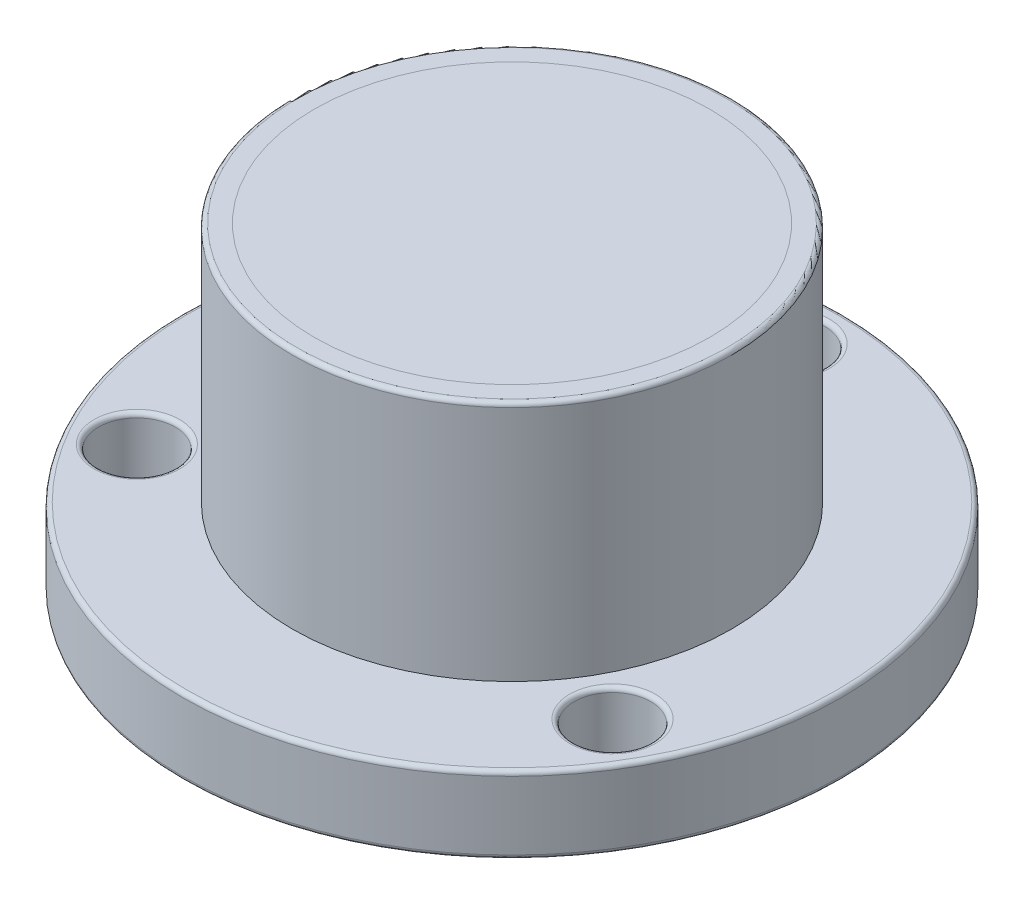
ISO-10303-21;
HEADER;
FILE_DESCRIPTION(('STEP AP214'),'2;1');
FILE_NAME('part.step','',(''),(''),'','','');
FILE_SCHEMA(('AUTOMOTIVE_DESIGN { 1 0 10303 214 1 1 1 1 }'));
ENDSEC;
DATA;
#1=APPLICATION_CONTEXT('core data for automotive mechanical design processes');
#2=APPLICATION_PROTOCOL_DEFINITION('international standard','automotive_design',2000,#1);
#3=PRODUCT_CONTEXT('',#1,'mechanical');
#4=PRODUCT('Part','Part','',(#3));
#5=PRODUCT_RELATED_PRODUCT_CATEGORY('part','',(#4));
#6=PRODUCT_DEFINITION_FORMATION('','',#4);
#7=PRODUCT_DEFINITION_CONTEXT('part definition',#1,'design');
#8=PRODUCT_DEFINITION('design','',#6,#7);
#9=PRODUCT_DEFINITION_SHAPE('','',#8);
#10=(LENGTH_UNIT() NAMED_UNIT(*) SI_UNIT(.MILLI.,.METRE.));
#11=(NAMED_UNIT(*) PLANE_ANGLE_UNIT() SI_UNIT($,.RADIAN.));
#12=(NAMED_UNIT(*) SI_UNIT($,.STERADIAN.) SOLID_ANGLE_UNIT());
#13=UNCERTAINTY_MEASURE_WITH_UNIT(LENGTH_MEASURE(1.E-05),#10,'distance_accuracy_value','');
#14=(GEOMETRIC_REPRESENTATION_CONTEXT(3) GLOBAL_UNCERTAINTY_ASSIGNED_CONTEXT((#13)) GLOBAL_UNIT_ASSIGNED_CONTEXT((#10,
#11,#12)) REPRESENTATION_CONTEXT('',''));
#15=CARTESIAN_POINT('',(0.,0.,0.));
#16=DIRECTION('',(0.,0.,1.));
#17=DIRECTION('',(1.,0.,0.));
#18=AXIS2_PLACEMENT_3D('',#15,#16,#17);
#19=CARTESIAN_POINT('',(0.,3.5,0.));
#20=DIRECTION('',(0.,-1.,0.));
#21=DIRECTION('',(0.,0.,-1.));
#22=AXIS2_PLACEMENT_3D('',#19,#20,#21);
#23=CYLINDRICAL_SURFACE('',#22,15.);
#24=CARTESIAN_POINT('',(0.,0.2,0.));
#25=DIRECTION('',(0.,1.,0.));
#26=DIRECTION('',(0.,0.,1.));
#27=AXIS2_PLACEMENT_3D('',#24,#25,#26);
#28=CIRCLE('',#27,15.);
#29=CARTESIAN_POINT('',(0.,0.2,15.));
#30=VERTEX_POINT('',#29);
#31=EDGE_CURVE('P0_E70',#30,#30,#28,.T.);
#32=ORIENTED_EDGE('',*,*,#31,.T.);
#33=EDGE_LOOP('',(#32));
#34=FACE_BOUND('',#33,.T.);
#35=CARTESIAN_POINT('',(0.,3.3,0.));
#36=DIRECTION('',(0.,1.,0.));
#37=DIRECTION('',(0.,0.,1.));
#38=AXIS2_PLACEMENT_3D('',#35,#36,#37);
#39=CIRCLE('',#38,15.);
#40=CARTESIAN_POINT('',(0.,3.3,15.));
#41=VERTEX_POINT('',#40);
#42=EDGE_CURVE('P0_E73',#41,#41,#39,.F.);
#43=ORIENTED_EDGE('',*,*,#42,.T.);
#44=EDGE_LOOP('',(#43));
#45=FACE_BOUND('',#44,.T.);
#46=ADVANCED_FACE('P0_F14',(#34,#45),#23,.T.);
#47=CARTESIAN_POINT('',(0.,3.5,0.));
#48=DIRECTION('',(0.,1.,0.));
#49=DIRECTION('',(0.,0.,1.));
#50=AXIS2_PLACEMENT_3D('',#47,#48,#49);
#51=PLANE('',#50);
#52=CARTESIAN_POINT('',(0.,3.5,0.));
#53=DIRECTION('',(0.,1.,0.));
#54=DIRECTION('',(0.,0.,1.));
#55=AXIS2_PLACEMENT_3D('',#52,#53,#54);
#56=CIRCLE('',#55,14.8);
#57=CARTESIAN_POINT('',(0.,3.5,14.8));
#58=VERTEX_POINT('',#57);
#59=EDGE_CURVE('P0_E46',#58,#58,#56,.T.);
#60=ORIENTED_EDGE('',*,*,#59,.T.);
#61=EDGE_LOOP('',(#60));
#62=FACE_BOUND('',#61,.T.);
#63=CARTESIAN_POINT('',(-10.8253175473049,3.5,6.25000000000031));
#64=DIRECTION('',(0.,1.,0.));
#65=DIRECTION('',(0.,0.,1.));
#66=AXIS2_PLACEMENT_3D('',#63,#64,#65);
#67=CIRCLE('',#66,1.95000000000071);
#68=CARTESIAN_POINT('',(-10.8253175473049,3.5,8.20000000000102));
#69=VERTEX_POINT('',#68);
#70=EDGE_CURVE('P0_E49',#69,#69,#67,.F.);
#71=ORIENTED_EDGE('',*,*,#70,.T.);
#72=EDGE_LOOP('',(#71));
#73=FACE_BOUND('',#72,.T.);
#74=CARTESIAN_POINT('',(10.825317547306,3.5,6.24999999999969));
#75=DIRECTION('',(0.,1.,0.));
#76=DIRECTION('',(0.,0.,1.));
#77=AXIS2_PLACEMENT_3D('',#74,#75,#76);
#78=CIRCLE('',#77,1.95000000000048);
#79=CARTESIAN_POINT('',(10.825317547306,3.5,8.20000000000017));
#80=VERTEX_POINT('',#79);
#81=EDGE_CURVE('P0_E52',#80,#80,#78,.F.);
#82=ORIENTED_EDGE('',*,*,#81,.T.);
#83=EDGE_LOOP('',(#82));
#84=FACE_BOUND('',#83,.T.);
#85=CARTESIAN_POINT('',(0.,3.5,-12.5));
#86=DIRECTION('',(0.,1.,0.));
#87=DIRECTION('',(0.,0.,1.));
#88=AXIS2_PLACEMENT_3D('',#85,#86,#87);
#89=CIRCLE('',#88,1.95);
#90=CARTESIAN_POINT('',(0.,3.5,-10.55));
#91=VERTEX_POINT('',#90);
#92=EDGE_CURVE('P0_E55',#91,#91,#89,.F.);
#93=ORIENTED_EDGE('',*,*,#92,.T.);
#94=EDGE_LOOP('',(#93));
#95=FACE_BOUND('',#94,.T.);
#96=CARTESIAN_POINT('',(0.,3.5,0.));
#97=DIRECTION('',(0.,1.,0.));
#98=DIRECTION('',(0.,0.,1.));
#99=AXIS2_PLACEMENT_3D('',#96,#97,#98);
#100=CIRCLE('',#99,10.);
#101=CARTESIAN_POINT('',(0.,3.5,-10.));
#102=VERTEX_POINT('',#101);
#103=EDGE_CURVE('P0_E76',#102,#102,#100,.T.);
#104=ORIENTED_EDGE('',*,*,#103,.F.);
#105=EDGE_LOOP('',(#104));
#106=FACE_BOUND('',#105,.T.);
#107=ADVANCED_FACE('P0_F116',(#62,#73,#84,#95,#106),#51,.T.);
#108=CARTESIAN_POINT('',(0.,0.,0.));
#109=DIRECTION('',(0.,1.,0.));
#110=DIRECTION('',(0.,0.,1.));
#111=AXIS2_PLACEMENT_3D('',#108,#109,#110);
#112=PLANE('',#111);
#113=CARTESIAN_POINT('',(0.,0.,0.));
#114=DIRECTION('',(0.,1.,0.));
#115=DIRECTION('',(0.,0.,1.));
#116=AXIS2_PLACEMENT_3D('',#113,#114,#115);
#117=CIRCLE('',#116,14.8);
#118=CARTESIAN_POINT('',(0.,0.,14.8));
#119=VERTEX_POINT('',#118);
#120=EDGE_CURVE('P0_E58',#119,#119,#117,.F.);
#121=ORIENTED_EDGE('',*,*,#120,.T.);
#122=EDGE_LOOP('',(#121));
#123=FACE_BOUND('',#122,.T.);
#124=CARTESIAN_POINT('',(-10.8253175473049,0.,6.25000000000031));
#125=DIRECTION('',(0.,1.,0.));
#126=DIRECTION('',(0.,0.,1.));
#127=AXIS2_PLACEMENT_3D('',#124,#125,#126);
#128=CIRCLE('',#127,1.95000000000071);
#129=CARTESIAN_POINT('',(-10.8253175473049,0.,8.20000000000102));
#130=VERTEX_POINT('',#129);
#131=EDGE_CURVE('P0_E61',#130,#130,#128,.T.);
#132=ORIENTED_EDGE('',*,*,#131,.T.);
#133=EDGE_LOOP('',(#132));
#134=FACE_BOUND('',#133,.T.);
#135=CARTESIAN_POINT('',(10.825317547306,0.,6.24999999999969));
#136=DIRECTION('',(0.,1.,0.));
#137=DIRECTION('',(0.,0.,1.));
#138=AXIS2_PLACEMENT_3D('',#135,#136,#137);
#139=CIRCLE('',#138,1.95000000000048);
#140=CARTESIAN_POINT('',(10.825317547306,0.,8.20000000000017));
#141=VERTEX_POINT('',#140);
#142=EDGE_CURVE('P0_E64',#141,#141,#139,.T.);
#143=ORIENTED_EDGE('',*,*,#142,.T.);
#144=EDGE_LOOP('',(#143));
#145=FACE_BOUND('',#144,.T.);
#146=CARTESIAN_POINT('',(0.,0.,-12.5));
#147=DIRECTION('',(0.,1.,0.));
#148=DIRECTION('',(0.,0.,1.));
#149=AXIS2_PLACEMENT_3D('',#146,#147,#148);
#150=CIRCLE('',#149,1.95);
#151=CARTESIAN_POINT('',(0.,0.,-10.55));
#152=VERTEX_POINT('',#151);
#153=EDGE_CURVE('P0_E67',#152,#152,#150,.T.);
#154=ORIENTED_EDGE('',*,*,#153,.T.);
#155=EDGE_LOOP('',(#154));
#156=FACE_BOUND('',#155,.T.);
#157=ADVANCED_FACE('P0_F122',(#123,#134,#145,#156),#112,.F.);
#158=CARTESIAN_POINT('',(0.,0.,-12.5));
#159=DIRECTION('',(0.,1.,0.));
#160=DIRECTION('',(0.,0.,1.));
#161=AXIS2_PLACEMENT_3D('',#158,#159,#160);
#162=CYLINDRICAL_SURFACE('',#161,1.75);
#163=CARTESIAN_POINT('',(0.,3.3,-12.5));
#164=DIRECTION('',(0.,1.,0.));
#165=DIRECTION('',(0.,0.,1.));
#166=AXIS2_PLACEMENT_3D('',#163,#164,#165);
#167=CIRCLE('',#166,1.75);
#168=CARTESIAN_POINT('',(0.,3.3,-10.75));
#169=VERTEX_POINT('',#168);
#170=EDGE_CURVE('P0_E25',#169,#169,#167,.T.);
#171=ORIENTED_EDGE('',*,*,#170,.T.);
#172=EDGE_LOOP('',(#171));
#173=FACE_BOUND('',#172,.T.);
#174=CARTESIAN_POINT('',(0.,0.2,-12.5));
#175=DIRECTION('',(0.,1.,0.));
#176=DIRECTION('',(0.,0.,1.));
#177=AXIS2_PLACEMENT_3D('',#174,#175,#176);
#178=CIRCLE('',#177,1.75);
#179=CARTESIAN_POINT('',(0.,0.2,-10.75));
#180=VERTEX_POINT('',#179);
#181=EDGE_CURVE('P0_E29',#180,#180,#178,.F.);
#182=ORIENTED_EDGE('',*,*,#181,.T.);
#183=EDGE_LOOP('',(#182));
#184=FACE_BOUND('',#183,.T.);
#185=ADVANCED_FACE('P0_F168',(#173,#184),#162,.F.);
#186=CARTESIAN_POINT('',(10.825317547306,0.,6.24999999999969));
#187=DIRECTION('',(0.,1.,0.));
#188=DIRECTION('',(0.,0.,1.));
#189=AXIS2_PLACEMENT_3D('',#186,#187,#188);
#190=CYLINDRICAL_SURFACE('',#189,1.75000000000048);
#191=CARTESIAN_POINT('',(10.825317547306,3.3,6.24999999999969));
#192=DIRECTION('',(0.,1.,0.));
#193=DIRECTION('',(0.,0.,1.));
#194=AXIS2_PLACEMENT_3D('',#191,#192,#193);
#195=CIRCLE('',#194,1.75000000000048);
#196=CARTESIAN_POINT('',(10.825317547306,3.3,8.00000000000017));
#197=VERTEX_POINT('',#196);
#198=EDGE_CURVE('P0_E34',#197,#197,#195,.T.);
#199=ORIENTED_EDGE('',*,*,#198,.T.);
#200=EDGE_LOOP('',(#199));
#201=FACE_BOUND('',#200,.T.);
#202=CARTESIAN_POINT('',(10.825317547306,0.2,6.24999999999969));
#203=DIRECTION('',(0.,1.,0.));
#204=DIRECTION('',(0.,0.,1.));
#205=AXIS2_PLACEMENT_3D('',#202,#203,#204);
#206=CIRCLE('',#205,1.75000000000048);
#207=CARTESIAN_POINT('',(10.825317547306,0.2,8.00000000000017));
#208=VERTEX_POINT('',#207);
#209=EDGE_CURVE('P0_E37',#208,#208,#206,.F.);
#210=ORIENTED_EDGE('',*,*,#209,.T.);
#211=EDGE_LOOP('',(#210));
#212=FACE_BOUND('',#211,.T.);
#213=ADVANCED_FACE('P0_F173',(#201,#212),#190,.F.);
#214=CARTESIAN_POINT('',(-10.8253175473049,0.,6.25000000000031));
#215=DIRECTION('',(0.,1.,0.));
#216=DIRECTION('',(0.,0.,1.));
#217=AXIS2_PLACEMENT_3D('',#214,#215,#216);
#218=CYLINDRICAL_SURFACE('',#217,1.75000000000071);
#219=CARTESIAN_POINT('',(-10.8253175473049,3.3,6.25000000000031));
#220=DIRECTION('',(0.,1.,0.));
#221=DIRECTION('',(0.,0.,1.));
#222=AXIS2_PLACEMENT_3D('',#219,#220,#221);
#223=CIRCLE('',#222,1.75000000000071);
#224=CARTESIAN_POINT('',(-10.8253175473049,3.3,8.00000000000102));
#225=VERTEX_POINT('',#224);
#226=EDGE_CURVE('P0_E40',#225,#225,#223,.T.);
#227=ORIENTED_EDGE('',*,*,#226,.T.);
#228=EDGE_LOOP('',(#227));
#229=FACE_BOUND('',#228,.T.);
#230=CARTESIAN_POINT('',(-10.8253175473049,0.2,6.25000000000031));
#231=DIRECTION('',(0.,1.,0.));
#232=DIRECTION('',(0.,0.,1.));
#233=AXIS2_PLACEMENT_3D('',#230,#231,#232);
#234=CIRCLE('',#233,1.75000000000071);
#235=CARTESIAN_POINT('',(-10.8253175473049,0.2,8.00000000000102));
#236=VERTEX_POINT('',#235);
#237=EDGE_CURVE('P0_E43',#236,#236,#234,.F.);
#238=ORIENTED_EDGE('',*,*,#237,.T.);
#239=EDGE_LOOP('',(#238));
#240=FACE_BOUND('',#239,.T.);
#241=ADVANCED_FACE('P0_F112',(#229,#240),#218,.F.);
#242=CARTESIAN_POINT('',(0.,14.5,0.));
#243=DIRECTION('',(0.,-1.,0.));
#244=DIRECTION('',(0.,0.,-1.));
#245=AXIS2_PLACEMENT_3D('',#242,#243,#244);
#246=CYLINDRICAL_SURFACE('',#245,10.);
#247=CARTESIAN_POINT('',(0.,14.3,0.));
#248=DIRECTION('',(0.,-1.,0.));
#249=DIRECTION('',(0.,0.,-1.));
#250=AXIS2_PLACEMENT_3D('',#247,#248,#249);
#251=CIRCLE('',#250,10.);
#252=CARTESIAN_POINT('',(0.,14.3,-10.));
#253=VERTEX_POINT('',#252);
#254=EDGE_CURVE('P0_E21',#253,#253,#251,.T.);
#255=CARTESIAN_POINT('',(0.,14.3,-10.));
#256=CARTESIAN_POINT('',(0.,14.1875,-10.));
#257=CARTESIAN_POINT('',(0.,14.075,-10.));
#258=CARTESIAN_POINT('',(0.,13.85,-10.));
#259=CARTESIAN_POINT('',(0.,13.7375,-10.));
#260=CARTESIAN_POINT('',(0.,13.5125,-10.));
#261=CARTESIAN_POINT('',(0.,13.4,-10.));
#262=CARTESIAN_POINT('',(0.,13.175,-10.));
#263=CARTESIAN_POINT('',(0.,13.0625,-10.));
#264=CARTESIAN_POINT('',(0.,12.8375,-10.));
#265=CARTESIAN_POINT('',(0.,12.725,-10.));
#266=CARTESIAN_POINT('',(0.,12.5,-10.));
#267=CARTESIAN_POINT('',(0.,12.3875,-10.));
#268=CARTESIAN_POINT('',(0.,12.1625,-10.));
#269=CARTESIAN_POINT('',(0.,12.05,-10.));
#270=CARTESIAN_POINT('',(0.,11.825,-10.));
#271=CARTESIAN_POINT('',(0.,11.7125,-10.));
#272=CARTESIAN_POINT('',(0.,11.4875,-10.));
#273=CARTESIAN_POINT('',(0.,11.375,-10.));
#274=CARTESIAN_POINT('',(0.,11.15,-10.));
#275=CARTESIAN_POINT('',(0.,11.0375,-10.));
#276=CARTESIAN_POINT('',(0.,10.8125,-10.));
#277=CARTESIAN_POINT('',(0.,10.7,-10.));
#278=CARTESIAN_POINT('',(0.,10.475,-10.));
#279=CARTESIAN_POINT('',(0.,10.3625,-10.));
#280=CARTESIAN_POINT('',(0.,10.1375,-10.));
#281=CARTESIAN_POINT('',(0.,10.025,-10.));
#282=CARTESIAN_POINT('',(0.,9.8,-10.));
#283=CARTESIAN_POINT('',(0.,9.6875,-10.));
#284=CARTESIAN_POINT('',(0.,9.4625,-10.));
#285=CARTESIAN_POINT('',(0.,9.35,-10.));
#286=CARTESIAN_POINT('',(0.,9.125,-10.));
#287=CARTESIAN_POINT('',(0.,9.0125,-10.));
#288=CARTESIAN_POINT('',(0.,8.7875,-10.));
#289=CARTESIAN_POINT('',(0.,8.675,-10.));
#290=CARTESIAN_POINT('',(0.,8.45,-10.));
#291=CARTESIAN_POINT('',(0.,8.3375,-10.));
#292=CARTESIAN_POINT('',(0.,8.1125,-10.));
#293=CARTESIAN_POINT('',(0.,8.,-10.));
#294=CARTESIAN_POINT('',(0.,7.775,-10.));
#295=CARTESIAN_POINT('',(0.,7.6625,-10.));
#296=CARTESIAN_POINT('',(0.,7.4375,-10.));
#297=CARTESIAN_POINT('',(0.,7.325,-10.));
#298=CARTESIAN_POINT('',(0.,7.1,-10.));
#299=CARTESIAN_POINT('',(0.,6.9875,-10.));
#300=CARTESIAN_POINT('',(0.,6.7625,-10.));
#301=CARTESIAN_POINT('',(0.,6.65,-10.));
#302=CARTESIAN_POINT('',(0.,6.425,-10.));
#303=CARTESIAN_POINT('',(0.,6.3125,-10.));
#304=CARTESIAN_POINT('',(0.,6.0875,-10.));
#305=CARTESIAN_POINT('',(0.,5.975,-10.));
#306=CARTESIAN_POINT('',(0.,5.75,-10.));
#307=CARTESIAN_POINT('',(0.,5.6375,-10.));
#308=CARTESIAN_POINT('',(0.,5.4125,-10.));
#309=CARTESIAN_POINT('',(0.,5.3,-10.));
#310=CARTESIAN_POINT('',(0.,5.075,-10.));
#311=CARTESIAN_POINT('',(0.,4.9625,-10.));
#312=CARTESIAN_POINT('',(0.,4.7375,-10.));
#313=CARTESIAN_POINT('',(0.,4.625,-10.));
#314=CARTESIAN_POINT('',(0.,4.4,-10.));
#315=CARTESIAN_POINT('',(0.,4.2875,-10.));
#316=CARTESIAN_POINT('',(0.,4.0625,-10.));
#317=CARTESIAN_POINT('',(0.,3.95,-10.));
#318=CARTESIAN_POINT('',(0.,3.725,-10.));
#319=CARTESIAN_POINT('',(0.,3.6125,-10.));
#320=CARTESIAN_POINT('',(0.,3.5,-10.));
#321=B_SPLINE_CURVE_WITH_KNOTS('',3,(#255,#256,#257,#258,#259,#260,#261,#262,#263,#264,#265,
#266,#267,#268,#269,#270,#271,#272,#273,#274,#275,#276,#277,#278,#279,#280,#281,#282,#283,#284,
#285,#286,#287,#288,#289,#290,#291,#292,#293,#294,#295,#296,#297,#298,#299,#300,#301,#302,#303,
#304,#305,#306,#307,#308,#309,#310,#311,#312,#313,#314,#315,#316,#317,#318,#319,#320),
.UNSPECIFIED.,.F.,.F.,(4,2,2,2,2,2,2,2,2,2,2,2,2,2,2,2,2,2,2,2,2,2,2,2,2,2,2,2,2,2,2,2,4),(0.,
0.337500000000001,0.675,1.0125,1.35,1.6875,2.025,2.3625,2.7,3.0375,3.375,3.7125,4.05,4.3875,
4.725,5.0625,5.4,5.7375,6.075,6.4125,6.75,7.0875,7.425,7.7625,8.1,8.4375,8.775,9.1125,9.45,
9.7875,10.125,10.4625,10.8),.UNSPECIFIED.);
#322=EDGE_CURVE('P0_BSEAM104',#253,#102,#321,.T.);
#323=ORIENTED_EDGE('',*,*,#254,.T.);
#324=ORIENTED_EDGE('',*,*,#103,.T.);
#325=ORIENTED_EDGE('',*,*,#322,.T.);
#326=ORIENTED_EDGE('',*,*,#322,.F.);
#327=EDGE_LOOP('',(#323,#325,#324,#326));
#328=FACE_BOUND('',#327,.T.);
#329=ADVANCED_FACE('P0_F104',(#328),#246,.T.);
#330=CARTESIAN_POINT('',(0.,14.5,0.));
#331=DIRECTION('',(0.,-1.,0.));
#332=DIRECTION('',(0.,0.,-1.));
#333=AXIS2_PLACEMENT_3D('',#330,#331,#332);
#334=PLANE('',#333);
#335=CARTESIAN_POINT('',(0.,14.5,0.));
#336=DIRECTION('',(0.,-1.,0.));
#337=DIRECTION('',(0.,0.,-1.));
#338=AXIS2_PLACEMENT_3D('',#335,#336,#337);
#339=CIRCLE('',#338,9.8);
#340=CARTESIAN_POINT('',(0.,14.5,-9.8));
#341=VERTEX_POINT('',#340);
#342=EDGE_CURVE('P0_E10',#341,#341,#339,.F.);
#343=ORIENTED_EDGE('',*,*,#342,.T.);
#344=EDGE_LOOP('',(#343));
#345=FACE_BOUND('',#344,.T.);
#346=CARTESIAN_POINT('',(0.,14.5,0.));
#347=DIRECTION('',(0.,1.,0.));
#348=DIRECTION('',(0.,0.,1.));
#349=AXIS2_PLACEMENT_3D('',#346,#347,#348);
#350=CIRCLE('',#349,9.);
#351=CARTESIAN_POINT('',(0.,14.5,9.));
#352=VERTEX_POINT('',#351);
#353=EDGE_CURVE('P0_E86',#352,#352,#350,.T.);
#354=ORIENTED_EDGE('',*,*,#353,.F.);
#355=EDGE_LOOP('',(#354));
#356=FACE_BOUND('',#355,.T.);
#357=ADVANCED_FACE('P0_F102',(#345,#356),#334,.F.);
#358=CARTESIAN_POINT('',(0.,13.5,0.));
#359=DIRECTION('',(0.,1.,0.));
#360=DIRECTION('',(0.,0.,1.));
#361=AXIS2_PLACEMENT_3D('',#358,#359,#360);
#362=PLANE('',#361);
#363=CARTESIAN_POINT('',(0.,13.5,0.));
#364=DIRECTION('',(0.,1.,0.));
#365=DIRECTION('',(0.,0.,1.));
#366=AXIS2_PLACEMENT_3D('',#363,#364,#365);
#367=CIRCLE('',#366,9.);
#368=CARTESIAN_POINT('',(0.,13.5,9.));
#369=VERTEX_POINT('',#368);
#370=EDGE_CURVE('P0_E81',#369,#369,#367,.T.);
#371=ORIENTED_EDGE('',*,*,#370,.T.);
#372=EDGE_LOOP('',(#371));
#373=FACE_BOUND('',#372,.T.);
#374=CARTESIAN_POINT('',(0.,13.5,0.));
#375=DIRECTION('',(0.,1.,0.));
#376=DIRECTION('',(0.,0.,1.));
#377=AXIS2_PLACEMENT_3D('',#374,#375,#376);
#378=CIRCLE('',#377,8.);
#379=CARTESIAN_POINT('',(0.,13.5,8.));
#380=VERTEX_POINT('',#379);
#381=EDGE_CURVE('P0_E77',#380,#380,#378,.F.);
#382=ORIENTED_EDGE('',*,*,#381,.T.);
#383=EDGE_LOOP('',(#382));
#384=FACE_BOUND('',#383,.T.);
#385=ADVANCED_FACE('P0_F92',(#373,#384),#362,.T.);
#386=CARTESIAN_POINT('',(0.,13.5,0.));
#387=DIRECTION('',(0.,1.,0.));
#388=DIRECTION('',(0.,0.,1.));
#389=AXIS2_PLACEMENT_3D('',#386,#387,#388);
#390=CYLINDRICAL_SURFACE('',#389,9.);
#391=ORIENTED_EDGE('',*,*,#370,.F.);
#392=EDGE_LOOP('',(#391));
#393=FACE_BOUND('',#392,.T.);
#394=ORIENTED_EDGE('',*,*,#353,.T.);
#395=EDGE_LOOP('',(#394));
#396=FACE_BOUND('',#395,.T.);
#397=ADVANCED_FACE('P0_F95',(#393,#396),#390,.F.);
#398=CARTESIAN_POINT('',(0.,6.5,0.));
#399=DIRECTION('',(0.,1.,0.));
#400=DIRECTION('',(0.,0.,1.));
#401=AXIS2_PLACEMENT_3D('',#398,#399,#400);
#402=PLANE('',#401);
#403=CARTESIAN_POINT('',(0.,6.5,0.));
#404=DIRECTION('',(0.,1.,0.));
#405=DIRECTION('',(0.,0.,1.));
#406=AXIS2_PLACEMENT_3D('',#403,#404,#405);
#407=CIRCLE('',#406,8.);
#408=CARTESIAN_POINT('',(0.,6.5,8.));
#409=VERTEX_POINT('',#408);
#410=EDGE_CURVE('P0_E80',#409,#409,#407,.T.);
#411=ORIENTED_EDGE('',*,*,#410,.T.);
#412=EDGE_LOOP('',(#411));
#413=FACE_BOUND('',#412,.T.);
#414=ADVANCED_FACE('P0_F98',(#413),#402,.T.);
#415=CARTESIAN_POINT('',(0.,6.5,0.));
#416=DIRECTION('',(0.,1.,0.));
#417=DIRECTION('',(0.,0.,1.));
#418=AXIS2_PLACEMENT_3D('',#415,#416,#417);
#419=CYLINDRICAL_SURFACE('',#418,8.);
#420=ORIENTED_EDGE('',*,*,#410,.F.);
#421=EDGE_LOOP('',(#420));
#422=FACE_BOUND('',#421,.T.);
#423=ORIENTED_EDGE('',*,*,#381,.F.);
#424=EDGE_LOOP('',(#423));
#425=FACE_BOUND('',#424,.T.);
#426=ADVANCED_FACE('P0_F132',(#422,#425),#419,.F.);
#427=CARTESIAN_POINT('',(0.,0.2,0.));
#428=DIRECTION('',(0.,1.,0.));
#429=DIRECTION('',(0.,0.,1.));
#430=AXIS2_PLACEMENT_3D('',#427,#428,#429);
#431=TOROIDAL_SURFACE('',#430,14.8,0.2);
#432=ORIENTED_EDGE('',*,*,#120,.F.);
#433=EDGE_LOOP('',(#432));
#434=FACE_BOUND('',#433,.T.);
#435=ORIENTED_EDGE('',*,*,#31,.F.);
#436=EDGE_LOOP('',(#435));
#437=FACE_BOUND('',#436,.T.);
#438=ADVANCED_FACE('P0_F128',(#434,#437),#431,.T.);
#439=CARTESIAN_POINT('',(0.,3.3,0.));
#440=DIRECTION('',(0.,1.,0.));
#441=DIRECTION('',(0.,0.,1.));
#442=AXIS2_PLACEMENT_3D('',#439,#440,#441);
#443=TOROIDAL_SURFACE('',#442,14.8,0.2);
#444=ORIENTED_EDGE('',*,*,#42,.F.);
#445=EDGE_LOOP('',(#444));
#446=FACE_BOUND('',#445,.T.);
#447=ORIENTED_EDGE('',*,*,#59,.F.);
#448=EDGE_LOOP('',(#447));
#449=FACE_BOUND('',#448,.T.);
#450=ADVANCED_FACE('P0_F131',(#446,#449),#443,.T.);
#451=CARTESIAN_POINT('',(-10.8253175473049,3.3,6.25000000000031));
#452=DIRECTION('',(0.,1.,0.));
#453=DIRECTION('',(0.,0.,1.));
#454=AXIS2_PLACEMENT_3D('',#451,#452,#453);
#455=TOROIDAL_SURFACE('',#454,1.95000000000071,0.2);
#456=ORIENTED_EDGE('',*,*,#70,.F.);
#457=EDGE_LOOP('',(#456));
#458=FACE_BOUND('',#457,.T.);
#459=ORIENTED_EDGE('',*,*,#226,.F.);
#460=EDGE_LOOP('',(#459));
#461=FACE_BOUND('',#460,.T.);
#462=ADVANCED_FACE('P0_F136',(#458,#461),#455,.T.);
#463=CARTESIAN_POINT('',(-10.8253175473049,0.2,6.25000000000031));
#464=DIRECTION('',(0.,1.,0.));
#465=DIRECTION('',(0.,0.,1.));
#466=AXIS2_PLACEMENT_3D('',#463,#464,#465);
#467=TOROIDAL_SURFACE('',#466,1.95000000000071,0.2);
#468=ORIENTED_EDGE('',*,*,#237,.F.);
#469=EDGE_LOOP('',(#468));
#470=FACE_BOUND('',#469,.T.);
#471=ORIENTED_EDGE('',*,*,#131,.F.);
#472=EDGE_LOOP('',(#471));
#473=FACE_BOUND('',#472,.T.);
#474=ADVANCED_FACE('P0_F140',(#470,#473),#467,.T.);
#475=CARTESIAN_POINT('',(10.825317547306,3.3,6.24999999999969));
#476=DIRECTION('',(0.,1.,0.));
#477=DIRECTION('',(0.,0.,1.));
#478=AXIS2_PLACEMENT_3D('',#475,#476,#477);
#479=TOROIDAL_SURFACE('',#478,1.95000000000048,0.2);
#480=ORIENTED_EDGE('',*,*,#81,.F.);
#481=EDGE_LOOP('',(#480));
#482=FACE_BOUND('',#481,.T.);
#483=ORIENTED_EDGE('',*,*,#198,.F.);
#484=EDGE_LOOP('',(#483));
#485=FACE_BOUND('',#484,.T.);
#486=ADVANCED_FACE('P0_F144',(#482,#485),#479,.T.);
#487=CARTESIAN_POINT('',(10.825317547306,0.2,6.24999999999969));
#488=DIRECTION('',(0.,1.,0.));
#489=DIRECTION('',(0.,0.,1.));
#490=AXIS2_PLACEMENT_3D('',#487,#488,#489);
#491=TOROIDAL_SURFACE('',#490,1.95000000000048,0.2);
#492=ORIENTED_EDGE('',*,*,#209,.F.);
#493=EDGE_LOOP('',(#492));
#494=FACE_BOUND('',#493,.T.);
#495=ORIENTED_EDGE('',*,*,#142,.F.);
#496=EDGE_LOOP('',(#495));
#497=FACE_BOUND('',#496,.T.);
#498=ADVANCED_FACE('P0_F148',(#494,#497),#491,.T.);
#499=CARTESIAN_POINT('',(0.,3.3,-12.5));
#500=DIRECTION('',(0.,1.,0.));
#501=DIRECTION('',(0.,0.,1.));
#502=AXIS2_PLACEMENT_3D('',#499,#500,#501);
#503=TOROIDAL_SURFACE('',#502,1.95,0.2);
#504=ORIENTED_EDGE('',*,*,#92,.F.);
#505=EDGE_LOOP('',(#504));
#506=FACE_BOUND('',#505,.T.);
#507=ORIENTED_EDGE('',*,*,#170,.F.);
#508=EDGE_LOOP('',(#507));
#509=FACE_BOUND('',#508,.T.);
#510=ADVANCED_FACE('P0_F152',(#506,#509),#503,.T.);
#511=CARTESIAN_POINT('',(0.,0.2,-12.5));
#512=DIRECTION('',(0.,1.,0.));
#513=DIRECTION('',(0.,0.,1.));
#514=AXIS2_PLACEMENT_3D('',#511,#512,#513);
#515=TOROIDAL_SURFACE('',#514,1.95,0.2);
#516=ORIENTED_EDGE('',*,*,#181,.F.);
#517=EDGE_LOOP('',(#516));
#518=FACE_BOUND('',#517,.T.);
#519=ORIENTED_EDGE('',*,*,#153,.F.);
#520=EDGE_LOOP('',(#519));
#521=FACE_BOUND('',#520,.T.);
#522=ADVANCED_FACE('P0_F155',(#518,#521),#515,.T.);
#523=CARTESIAN_POINT('',(0.,14.3,0.));
#524=DIRECTION('',(0.,-1.,0.));
#525=DIRECTION('',(0.,0.,-1.));
#526=AXIS2_PLACEMENT_3D('',#523,#524,#525);
#527=TOROIDAL_SURFACE('',#526,9.8,0.2);
#528=ORIENTED_EDGE('',*,*,#342,.F.);
#529=EDGE_LOOP('',(#528));
#530=FACE_BOUND('',#529,.T.);
#531=ORIENTED_EDGE('',*,*,#254,.F.);
#532=EDGE_LOOP('',(#531));
#533=FACE_BOUND('',#532,.T.);
#534=ADVANCED_FACE('P0_F16',(#530,#533),#527,.T.);
#535=CLOSED_SHELL('',(#46,#107,#157,#185,#213,#241,#329,#357,#385,#397,#414,#426,#438,#450,#462,
#474,#486,#498,#510,#522,#534));
#536=MANIFOLD_SOLID_BREP('P0_B1',#535);
#537=CARTESIAN_POINT('',(0.,14.4,0.));
#538=DIRECTION('',(0.,-1.,0.));
#539=DIRECTION('',(-1.,0.,0.));
#540=AXIS2_PLACEMENT_3D('',#537,#538,#539);
#541=PLANE('',#540);
#542=CARTESIAN_POINT('',(0.,14.4,0.));
#543=DIRECTION('',(0.,-1.,0.));
#544=DIRECTION('',(-1.,0.,0.));
#545=AXIS2_PLACEMENT_3D('',#542,#543,#544);
#546=CIRCLE('',#545,4.3);
#547=CARTESIAN_POINT('',(-4.3,14.4,0.));
#548=VERTEX_POINT('',#547);
#549=EDGE_CURVE('P1_E10',#548,#548,#546,.T.);
#550=ORIENTED_EDGE('',*,*,#549,.T.);
#551=EDGE_LOOP('',(#550));
#552=FACE_BOUND('',#551,.T.);
#553=CARTESIAN_POINT('',(0.,14.4,0.));
#554=DIRECTION('',(0.,-1.,0.));
#555=DIRECTION('',(-1.,0.,0.));
#556=AXIS2_PLACEMENT_3D('',#553,#554,#555);
#557=CIRCLE('',#556,4.);
#558=CARTESIAN_POINT('',(-4.,14.4,0.));
#559=VERTEX_POINT('',#558);
#560=EDGE_CURVE('P1_E25',#559,#559,#557,.T.);
#561=ORIENTED_EDGE('',*,*,#560,.F.);
#562=EDGE_LOOP('',(#561));
#563=FACE_BOUND('',#562,.T.);
#564=ADVANCED_FACE('P1_F14',(#552,#563),#541,.T.);
#565=CARTESIAN_POINT('',(0.,14.5,0.));
#566=DIRECTION('',(0.,-1.,0.));
#567=DIRECTION('',(-1.,0.,0.));
#568=AXIS2_PLACEMENT_3D('',#565,#566,#567);
#569=PLANE('',#568);
#570=CARTESIAN_POINT('',(0.,14.5,0.));
#571=DIRECTION('',(0.,-1.,0.));
#572=DIRECTION('',(-1.,0.,0.));
#573=AXIS2_PLACEMENT_3D('',#570,#571,#572);
#574=CIRCLE('',#573,4.3);
#575=CARTESIAN_POINT('',(-4.3,14.5,0.));
#576=VERTEX_POINT('',#575);
#577=EDGE_CURVE('P1_E18',#576,#576,#574,.T.);
#578=ORIENTED_EDGE('',*,*,#577,.F.);
#579=EDGE_LOOP('',(#578));
#580=FACE_BOUND('',#579,.T.);
#581=CARTESIAN_POINT('',(0.,14.5,0.));
#582=DIRECTION('',(0.,-1.,0.));
#583=DIRECTION('',(-1.,0.,0.));
#584=AXIS2_PLACEMENT_3D('',#581,#582,#583);
#585=CIRCLE('',#584,4.);
#586=CARTESIAN_POINT('',(-4.,14.5,0.));
#587=VERTEX_POINT('',#586);
#588=EDGE_CURVE('P1_E27',#587,#587,#585,.T.);
#589=ORIENTED_EDGE('',*,*,#588,.T.);
#590=EDGE_LOOP('',(#589));
#591=FACE_BOUND('',#590,.T.);
#592=ADVANCED_FACE('P1_F37',(#580,#591),#569,.F.);
#593=CARTESIAN_POINT('',(0.,14.4,0.));
#594=DIRECTION('',(0.,1.,0.));
#595=DIRECTION('',(1.,0.,0.));
#596=AXIS2_PLACEMENT_3D('',#593,#594,#595);
#597=CYLINDRICAL_SURFACE('',#596,4.3);
#598=ORIENTED_EDGE('',*,*,#549,.F.);
#599=EDGE_LOOP('',(#598));
#600=FACE_BOUND('',#599,.T.);
#601=ORIENTED_EDGE('',*,*,#577,.T.);
#602=EDGE_LOOP('',(#601));
#603=FACE_BOUND('',#602,.T.);
#604=ADVANCED_FACE('P1_F16',(#600,#603),#597,.T.);
#605=CARTESIAN_POINT('',(0.,14.4,0.));
#606=DIRECTION('',(0.,1.,0.));
#607=DIRECTION('',(1.,0.,0.));
#608=AXIS2_PLACEMENT_3D('',#605,#606,#607);
#609=CYLINDRICAL_SURFACE('',#608,4.);
#610=ORIENTED_EDGE('',*,*,#560,.T.);
#611=EDGE_LOOP('',(#610));
#612=FACE_BOUND('',#611,.T.);
#613=ORIENTED_EDGE('',*,*,#588,.F.);
#614=EDGE_LOOP('',(#613));
#615=FACE_BOUND('',#614,.T.);
#616=ADVANCED_FACE('P1_F33',(#612,#615),#609,.F.);
#617=CLOSED_SHELL('',(#564,#592,#604,#616));
#618=MANIFOLD_SOLID_BREP('P1_B1',#617);
#619=CARTESIAN_POINT('',(0.,14.5,0.));
#620=DIRECTION('',(0.,-1.,0.));
#621=DIRECTION('',(-1.,0.,0.));
#622=AXIS2_PLACEMENT_3D('',#619,#620,#621);
#623=CYLINDRICAL_SURFACE('',#622,9.);
#624=CARTESIAN_POINT('',(0.,14.5,0.));
#625=DIRECTION('',(0.,1.,0.));
#626=DIRECTION('',(1.,0.,0.));
#627=AXIS2_PLACEMENT_3D('',#624,#625,#626);
#628=CIRCLE('',#627,9.);
#629=CARTESIAN_POINT('',(9.,14.5,0.));
#630=VERTEX_POINT('',#629);
#631=EDGE_CURVE('P2_E10',#630,#630,#628,.T.);
#632=ORIENTED_EDGE('',*,*,#631,.F.);
#633=EDGE_LOOP('',(#632));
#634=FACE_BOUND('',#633,.T.);
#635=CARTESIAN_POINT('',(0.,13.5,0.));
#636=DIRECTION('',(0.,1.,0.));
#637=DIRECTION('',(1.,0.,0.));
#638=AXIS2_PLACEMENT_3D('',#635,#636,#637);
#639=CIRCLE('',#638,9.);
#640=CARTESIAN_POINT('',(9.,13.5,0.));
#641=VERTEX_POINT('',#640);
#642=EDGE_CURVE('P2_E17',#641,#641,#639,.T.);
#643=ORIENTED_EDGE('',*,*,#642,.T.);
#644=EDGE_LOOP('',(#643));
#645=FACE_BOUND('',#644,.T.);
#646=ADVANCED_FACE('P2_F14',(#634,#645),#623,.T.);
#647=CARTESIAN_POINT('',(0.,14.5,0.));
#648=DIRECTION('',(0.,1.,0.));
#649=DIRECTION('',(1.,0.,0.));
#650=AXIS2_PLACEMENT_3D('',#647,#648,#649);
#651=PLANE('',#650);
#652=ORIENTED_EDGE('',*,*,#631,.T.);
#653=EDGE_LOOP('',(#652));
#654=FACE_BOUND('',#653,.T.);
#655=ADVANCED_FACE('P2_F29',(#654),#651,.T.);
#656=CARTESIAN_POINT('',(0.,13.5,0.));
#657=DIRECTION('',(0.,1.,0.));
#658=DIRECTION('',(1.,0.,0.));
#659=AXIS2_PLACEMENT_3D('',#656,#657,#658);
#660=PLANE('',#659);
#661=ORIENTED_EDGE('',*,*,#642,.F.);
#662=EDGE_LOOP('',(#661));
#663=FACE_BOUND('',#662,.T.);
#664=ADVANCED_FACE('P2_F27',(#663),#660,.F.);
#665=CLOSED_SHELL('',(#646,#655,#664));
#666=MANIFOLD_SOLID_BREP('P2_B1',#665);
#667=CARTESIAN_POINT('',(0.,12.,0.));
#668=DIRECTION('',(0.,-1.,0.));
#669=DIRECTION('',(-0.546944138603989,0.,0.837169104331222));
#670=AXIS2_PLACEMENT_3D('',#667,#668,#669);
#671=PLANE('',#670);
#672=CARTESIAN_POINT('',(0.,12.,0.));
#673=DIRECTION('',(0.,-1.,0.));
#674=DIRECTION('',(-0.546944138603989,0.,0.837169104331222));
#675=AXIS2_PLACEMENT_3D('',#672,#673,#674);
#676=CIRCLE('',#675,0.401923788646686);
#677=CARTESIAN_POINT('',(-0.219829860365813,12.,0.336478178150758));
#678=VERTEX_POINT('',#677);
#679=EDGE_CURVE('P3_E9',#678,#678,#676,.T.);
#680=ORIENTED_EDGE('',*,*,#679,.T.);
#681=EDGE_LOOP('',(#680));
#682=FACE_BOUND('',#681,.T.);
#683=ADVANCED_FACE('P3_F13',(#682),#671,.T.);
#684=CARTESIAN_POINT('',(0.,13.5,0.));
#685=DIRECTION('',(0.,-1.,0.));
#686=DIRECTION('',(-0.546944138603989,0.,0.837169104331222));
#687=AXIS2_PLACEMENT_3D('',#684,#685,#686);
#688=PLANE('',#687);
#689=CARTESIAN_POINT('',(0.,13.5,0.));
#690=DIRECTION('',(0.,-1.,0.));
#691=DIRECTION('',(-0.546944138603989,0.,0.837169104331222));
#692=AXIS2_PLACEMENT_3D('',#689,#690,#691);
#693=CIRCLE('',#692,3.);
#694=CARTESIAN_POINT('',(-1.64083241581197,13.5,2.51150731299367));
#695=VERTEX_POINT('',#694);
#696=EDGE_CURVE('P3_E20',#695,#695,#693,.T.);
#697=ORIENTED_EDGE('',*,*,#696,.F.);
#698=EDGE_LOOP('',(#697));
#699=FACE_BOUND('',#698,.T.);
#700=ADVANCED_FACE('P3_F28',(#699),#688,.F.);
#701=CARTESIAN_POINT('',(0.,15.,0.));
#702=DIRECTION('',(0.,1.,0.));
#703=DIRECTION('',(0.546944138603989,0.,-0.837169104331222));
#704=AXIS2_PLACEMENT_3D('',#701,#702,#703);
#705=DEGENERATE_TOROIDAL_SURFACE('',#704,0.401923788646686,3.,.T.);
#706=ORIENTED_EDGE('',*,*,#696,.T.);
#707=EDGE_LOOP('',(#706));
#708=FACE_BOUND('',#707,.T.);
#709=ORIENTED_EDGE('',*,*,#679,.F.);
#710=EDGE_LOOP('',(#709));
#711=FACE_BOUND('',#710,.T.);
#712=ADVANCED_FACE('P3_F15',(#708,#711),#705,.T.);
#713=CLOSED_SHELL('',(#683,#700,#712));
#714=MANIFOLD_SOLID_BREP('P3_B1',#713);
#715=ADVANCED_BREP_SHAPE_REPRESENTATION('',(#18,#536,#618,#666,#714),#14);
#716=SHAPE_DEFINITION_REPRESENTATION(#9,#715);
ENDSEC;
END-ISO-10303-21;
